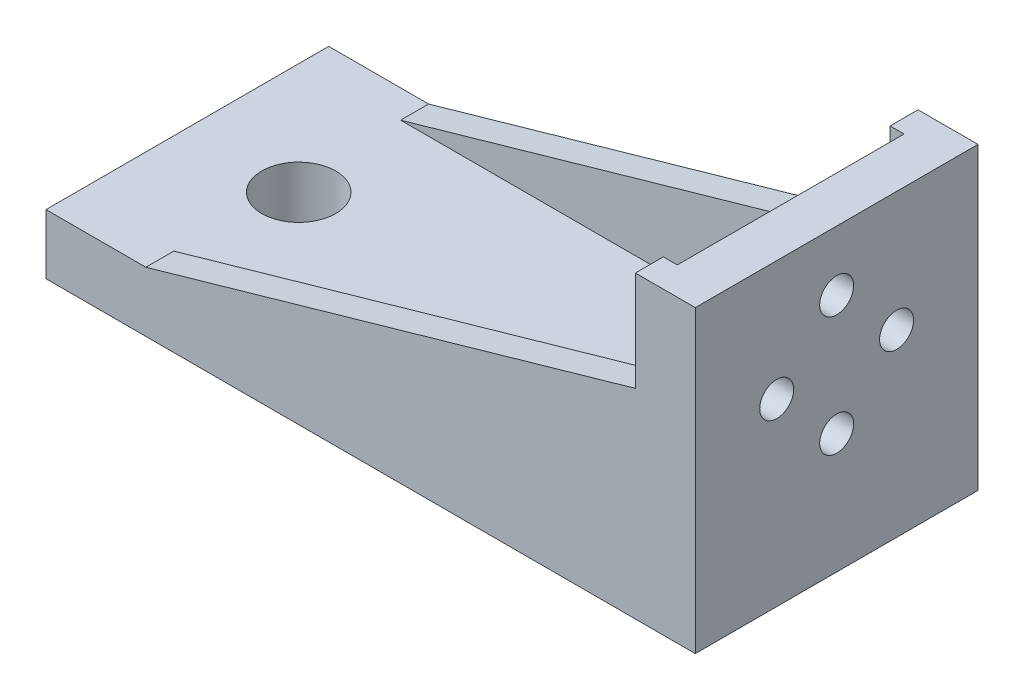
ISO-10303-21;
HEADER;
FILE_DESCRIPTION(('STEP AP214'),'2;1');
FILE_NAME('part.step','',(''),(''),'','','');
FILE_SCHEMA(('AUTOMOTIVE_DESIGN { 1 0 10303 214 1 1 1 1 }'));
ENDSEC;
DATA;
#1=APPLICATION_CONTEXT('core data for automotive mechanical design processes');
#2=APPLICATION_PROTOCOL_DEFINITION('international standard','automotive_design',2000,#1);
#3=PRODUCT_CONTEXT('',#1,'mechanical');
#4=PRODUCT('Part','Part','',(#3));
#5=PRODUCT_RELATED_PRODUCT_CATEGORY('part','',(#4));
#6=PRODUCT_DEFINITION_FORMATION('','',#4);
#7=PRODUCT_DEFINITION_CONTEXT('part definition',#1,'design');
#8=PRODUCT_DEFINITION('design','',#6,#7);
#9=PRODUCT_DEFINITION_SHAPE('','',#8);
#10=(LENGTH_UNIT() NAMED_UNIT(*) SI_UNIT(.MILLI.,.METRE.));
#11=(NAMED_UNIT(*) PLANE_ANGLE_UNIT() SI_UNIT($,.RADIAN.));
#12=(NAMED_UNIT(*) SI_UNIT($,.STERADIAN.) SOLID_ANGLE_UNIT());
#13=UNCERTAINTY_MEASURE_WITH_UNIT(LENGTH_MEASURE(1.E-05),#10,'distance_accuracy_value','');
#14=(GEOMETRIC_REPRESENTATION_CONTEXT(3) GLOBAL_UNCERTAINTY_ASSIGNED_CONTEXT((#13)) GLOBAL_UNIT_ASSIGNED_CONTEXT((#10,
#11,#12)) REPRESENTATION_CONTEXT('',''));
#15=CARTESIAN_POINT('',(0.,0.,0.));
#16=DIRECTION('',(0.,0.,1.));
#17=DIRECTION('',(1.,0.,0.));
#18=AXIS2_PLACEMENT_3D('',#15,#16,#17);
#19=CARTESIAN_POINT('',(59.,30.,14.15));
#20=DIRECTION('',(1.,0.,0.));
#21=DIRECTION('',(0.,1.,0.));
#22=AXIS2_PLACEMENT_3D('',#19,#20,#21);
#23=PLANE('',#22);
#24=DIRECTION('',(0.,-1.,0.));
#25=VECTOR('',#24,1.);
#26=CARTESIAN_POINT('',(59.,30.,-11.35));
#27=LINE('',#26,#25);
#28=CARTESIAN_POINT('',(59.,30.,-11.35));
#29=VERTEX_POINT('',#28);
#30=CARTESIAN_POINT('',(59.,20.,-11.35));
#31=VERTEX_POINT('',#30);
#32=EDGE_CURVE('E50',#29,#31,#27,.T.);
#33=ORIENTED_EDGE('',*,*,#32,.F.);
#34=DIRECTION('',(0.,0.,-1.));
#35=VECTOR('',#34,1.);
#36=CARTESIAN_POINT('',(59.,30.,14.15));
#37=LINE('',#36,#35);
#38=CARTESIAN_POINT('',(59.,30.,-14.15));
#39=VERTEX_POINT('',#38);
#40=EDGE_CURVE('E129',#29,#39,#37,.T.);
#41=ORIENTED_EDGE('',*,*,#40,.T.);
#42=DIRECTION('',(0.,-1.,0.));
#43=VECTOR('',#42,1.);
#44=CARTESIAN_POINT('',(59.,30.,-14.15));
#45=LINE('',#44,#43);
#46=CARTESIAN_POINT('',(59.,20.,-14.15));
#47=VERTEX_POINT('',#46);
#48=EDGE_CURVE('E148',#39,#47,#45,.T.);
#49=ORIENTED_EDGE('',*,*,#48,.T.);
#50=DIRECTION('',(0.,0.,-1.));
#51=VECTOR('',#50,1.);
#52=CARTESIAN_POINT('',(59.,20.,14.15));
#53=LINE('',#52,#51);
#54=EDGE_CURVE('E130',#31,#47,#53,.T.);
#55=ORIENTED_EDGE('',*,*,#54,.F.);
#56=EDGE_LOOP('',(#33,#41,#49,#55));
#57=FACE_BOUND('',#56,.T.);
#58=ADVANCED_FACE('F35',(#57),#23,.F.);
#59=CARTESIAN_POINT('',(59.,20.,14.15));
#60=DIRECTION('',(0.274721127897378,-0.961523947640823,0.));
#61=DIRECTION('',(0.961523947640823,0.274721127897378,0.));
#62=AXIS2_PLACEMENT_3D('',#59,#60,#61);
#63=PLANE('',#62);
#64=DIRECTION('',(-0.961523947640823,-0.274721127897378,0.));
#65=VECTOR('',#64,1.);
#66=CARTESIAN_POINT('',(59.,20.,-11.35));
#67=LINE('',#66,#65);
#68=CARTESIAN_POINT('',(10.,6.,-11.35));
#69=VERTEX_POINT('',#68);
#70=EDGE_CURVE('E192',#31,#69,#67,.T.);
#71=ORIENTED_EDGE('',*,*,#70,.F.);
#72=ORIENTED_EDGE('',*,*,#54,.T.);
#73=DIRECTION('',(-0.961523947640823,-0.274721127897378,0.));
#74=VECTOR('',#73,1.);
#75=CARTESIAN_POINT('',(59.,20.,-14.15));
#76=LINE('',#75,#74);
#77=CARTESIAN_POINT('',(10.,6.,-14.15));
#78=VERTEX_POINT('',#77);
#79=EDGE_CURVE('E151',#47,#78,#76,.T.);
#80=ORIENTED_EDGE('',*,*,#79,.T.);
#81=DIRECTION('',(0.,0.,-1.));
#82=VECTOR('',#81,1.);
#83=CARTESIAN_POINT('',(10.,6.,14.15));
#84=LINE('',#83,#82);
#85=EDGE_CURVE('E158',#69,#78,#84,.T.);
#86=ORIENTED_EDGE('',*,*,#85,.F.);
#87=EDGE_LOOP('',(#71,#72,#80,#86));
#88=FACE_BOUND('',#87,.T.);
#89=ADVANCED_FACE('F304',(#88),#63,.F.);
#90=CARTESIAN_POINT('',(0.,6.,14.15));
#91=DIRECTION('',(1.,0.,0.));
#92=DIRECTION('',(0.,1.,0.));
#93=AXIS2_PLACEMENT_3D('',#90,#91,#92);
#94=PLANE('',#93);
#95=DIRECTION('',(0.,-1.,0.));
#96=VECTOR('',#95,1.);
#97=CARTESIAN_POINT('',(0.,6.,-14.15));
#98=LINE('',#97,#96);
#99=CARTESIAN_POINT('',(0.,6.,-14.15));
#100=VERTEX_POINT('',#99);
#101=CARTESIAN_POINT('',(0.,0.,-14.15));
#102=VERTEX_POINT('',#101);
#103=EDGE_CURVE('E139',#100,#102,#98,.T.);
#104=ORIENTED_EDGE('',*,*,#103,.T.);
#105=DIRECTION('',(0.,0.,-1.));
#106=VECTOR('',#105,1.);
#107=CARTESIAN_POINT('',(0.,0.,14.15));
#108=LINE('',#107,#106);
#109=CARTESIAN_POINT('',(0.,0.,14.15));
#110=VERTEX_POINT('',#109);
#111=EDGE_CURVE('E11',#110,#102,#108,.T.);
#112=ORIENTED_EDGE('',*,*,#111,.F.);
#113=DIRECTION('',(0.,-1.,0.));
#114=VECTOR('',#113,1.);
#115=CARTESIAN_POINT('',(0.,6.,14.15));
#116=LINE('',#115,#114);
#117=CARTESIAN_POINT('',(0.,6.,14.15));
#118=VERTEX_POINT('',#117);
#119=EDGE_CURVE('E156',#118,#110,#116,.T.);
#120=ORIENTED_EDGE('',*,*,#119,.F.);
#121=DIRECTION('',(0.,0.,-1.));
#122=VECTOR('',#121,1.);
#123=CARTESIAN_POINT('',(0.,6.,14.15));
#124=LINE('',#123,#122);
#125=EDGE_CURVE('E89',#118,#100,#124,.T.);
#126=ORIENTED_EDGE('',*,*,#125,.T.);
#127=EDGE_LOOP('',(#104,#112,#120,#126));
#128=FACE_BOUND('',#127,.T.);
#129=ADVANCED_FACE('F37',(#128),#94,.F.);
#130=CARTESIAN_POINT('',(0.,0.,14.15));
#131=DIRECTION('',(0.,1.,0.));
#132=DIRECTION('',(0.,0.,1.));
#133=AXIS2_PLACEMENT_3D('',#130,#131,#132);
#134=PLANE('',#133);
#135=CARTESIAN_POINT('',(50.85,0.,0.));
#136=DIRECTION('',(0.,1.,0.));
#137=DIRECTION('',(0.,0.,1.));
#138=AXIS2_PLACEMENT_3D('',#135,#136,#137);
#139=CIRCLE('',#138,2.55);
#140=CARTESIAN_POINT('',(50.85,0.,2.55));
#141=VERTEX_POINT('',#140);
#142=EDGE_CURVE('E210',#141,#141,#139,.T.);
#143=ORIENTED_EDGE('',*,*,#142,.T.);
#144=EDGE_LOOP('',(#143));
#145=FACE_BOUND('',#144,.T.);
#146=CARTESIAN_POINT('',(11.15,0.,0.));
#147=DIRECTION('',(0.,1.,0.));
#148=DIRECTION('',(0.,0.,1.));
#149=AXIS2_PLACEMENT_3D('',#146,#147,#148);
#150=CIRCLE('',#149,3.7);
#151=CARTESIAN_POINT('',(11.15,0.,3.7));
#152=VERTEX_POINT('',#151);
#153=EDGE_CURVE('E220',#152,#152,#150,.T.);
#154=ORIENTED_EDGE('',*,*,#153,.T.);
#155=EDGE_LOOP('',(#154));
#156=FACE_BOUND('',#155,.T.);
#157=DIRECTION('',(1.,0.,0.));
#158=VECTOR('',#157,1.);
#159=CARTESIAN_POINT('',(0.,0.,-14.15));
#160=LINE('',#159,#158);
#161=CARTESIAN_POINT('',(65.,0.,-14.15));
#162=VERTEX_POINT('',#161);
#163=EDGE_CURVE('E141',#102,#162,#160,.T.);
#164=ORIENTED_EDGE('',*,*,#163,.T.);
#165=DIRECTION('',(0.,0.,-1.));
#166=VECTOR('',#165,1.);
#167=CARTESIAN_POINT('',(65.,0.,14.15));
#168=LINE('',#167,#166);
#169=CARTESIAN_POINT('',(65.,0.,14.15));
#170=VERTEX_POINT('',#169);
#171=EDGE_CURVE('E43',#170,#162,#168,.T.);
#172=ORIENTED_EDGE('',*,*,#171,.F.);
#173=DIRECTION('',(1.,0.,0.));
#174=VECTOR('',#173,1.);
#175=CARTESIAN_POINT('',(0.,0.,14.15));
#176=LINE('',#175,#174);
#177=EDGE_CURVE('E97',#110,#170,#176,.T.);
#178=ORIENTED_EDGE('',*,*,#177,.F.);
#179=ORIENTED_EDGE('',*,*,#111,.T.);
#180=EDGE_LOOP('',(#164,#172,#178,#179));
#181=FACE_BOUND('',#180,.T.);
#182=ADVANCED_FACE('F295',(#145,#156,#181),#134,.F.);
#183=CARTESIAN_POINT('',(65.,0.,14.15));
#184=DIRECTION('',(-1.,0.,0.));
#185=DIRECTION('',(0.,0.,1.));
#186=AXIS2_PLACEMENT_3D('',#183,#184,#185);
#187=PLANE('',#186);
#188=CARTESIAN_POINT('',(65.,24.,0.));
#189=DIRECTION('',(-1.,0.,0.));
#190=DIRECTION('',(0.,0.,1.));
#191=AXIS2_PLACEMENT_3D('',#188,#189,#190);
#192=CIRCLE('',#191,1.7);
#193=CARTESIAN_POINT('',(65.,24.,1.7));
#194=VERTEX_POINT('',#193);
#195=EDGE_CURVE('E247',#194,#194,#192,.T.);
#196=ORIENTED_EDGE('',*,*,#195,.T.);
#197=EDGE_LOOP('',(#196));
#198=FACE_BOUND('',#197,.T.);
#199=CARTESIAN_POINT('',(65.,12.,0.));
#200=DIRECTION('',(-1.,0.,0.));
#201=DIRECTION('',(0.,0.,1.));
#202=AXIS2_PLACEMENT_3D('',#199,#200,#201);
#203=CIRCLE('',#202,1.7);
#204=CARTESIAN_POINT('',(65.,12.,1.7));
#205=VERTEX_POINT('',#204);
#206=EDGE_CURVE('E241',#205,#205,#203,.T.);
#207=ORIENTED_EDGE('',*,*,#206,.T.);
#208=EDGE_LOOP('',(#207));
#209=FACE_BOUND('',#208,.T.);
#210=CARTESIAN_POINT('',(65.,18.,6.));
#211=DIRECTION('',(-1.,0.,0.));
#212=DIRECTION('',(0.,0.,1.));
#213=AXIS2_PLACEMENT_3D('',#210,#211,#212);
#214=CIRCLE('',#213,1.7);
#215=CARTESIAN_POINT('',(65.,18.,7.7));
#216=VERTEX_POINT('',#215);
#217=EDGE_CURVE('E235',#216,#216,#214,.T.);
#218=ORIENTED_EDGE('',*,*,#217,.T.);
#219=EDGE_LOOP('',(#218));
#220=FACE_BOUND('',#219,.T.);
#221=CARTESIAN_POINT('',(65.,18.,-6.));
#222=DIRECTION('',(-1.,0.,0.));
#223=DIRECTION('',(0.,0.,1.));
#224=AXIS2_PLACEMENT_3D('',#221,#222,#223);
#225=CIRCLE('',#224,1.7);
#226=CARTESIAN_POINT('',(65.,18.,-4.3));
#227=VERTEX_POINT('',#226);
#228=EDGE_CURVE('E229',#227,#227,#225,.T.);
#229=ORIENTED_EDGE('',*,*,#228,.T.);
#230=EDGE_LOOP('',(#229));
#231=FACE_BOUND('',#230,.T.);
#232=DIRECTION('',(0.,1.,0.));
#233=VECTOR('',#232,1.);
#234=CARTESIAN_POINT('',(65.,0.,-14.15));
#235=LINE('',#234,#233);
#236=CARTESIAN_POINT('',(65.,30.,-14.15));
#237=VERTEX_POINT('',#236);
#238=EDGE_CURVE('E143',#162,#237,#235,.T.);
#239=ORIENTED_EDGE('',*,*,#238,.T.);
#240=DIRECTION('',(0.,0.,-1.));
#241=VECTOR('',#240,1.);
#242=CARTESIAN_POINT('',(65.,30.,14.15));
#243=LINE('',#242,#241);
#244=CARTESIAN_POINT('',(65.,30.,14.15));
#245=VERTEX_POINT('',#244);
#246=EDGE_CURVE('E162',#245,#237,#243,.T.);
#247=ORIENTED_EDGE('',*,*,#246,.F.);
#248=DIRECTION('',(0.,1.,0.));
#249=VECTOR('',#248,1.);
#250=CARTESIAN_POINT('',(65.,0.,14.15));
#251=LINE('',#250,#249);
#252=EDGE_CURVE('E170',#170,#245,#251,.T.);
#253=ORIENTED_EDGE('',*,*,#252,.F.);
#254=ORIENTED_EDGE('',*,*,#171,.T.);
#255=EDGE_LOOP('',(#239,#247,#253,#254));
#256=FACE_BOUND('',#255,.T.);
#257=ADVANCED_FACE('F168',(#198,#209,#220,#231,#256),#187,.F.);
#258=CARTESIAN_POINT('',(65.,30.,14.15));
#259=DIRECTION('',(0.,-1.,0.));
#260=DIRECTION('',(1.,0.,0.));
#261=AXIS2_PLACEMENT_3D('',#258,#259,#260);
#262=PLANE('',#261);
#263=DIRECTION('',(0.,0.,-1.));
#264=VECTOR('',#263,1.);
#265=CARTESIAN_POINT('',(60.4,30.,11.35));
#266=LINE('',#265,#264);
#267=CARTESIAN_POINT('',(60.4,30.,11.35));
#268=VERTEX_POINT('',#267);
#269=CARTESIAN_POINT('',(60.4,30.,-11.35));
#270=VERTEX_POINT('',#269);
#271=EDGE_CURVE('E197',#268,#270,#266,.T.);
#272=ORIENTED_EDGE('',*,*,#271,.F.);
#273=DIRECTION('',(-1.,0.,0.));
#274=VECTOR('',#273,1.);
#275=CARTESIAN_POINT('',(60.4,30.,11.35));
#276=LINE('',#275,#274);
#277=CARTESIAN_POINT('',(59.,30.,11.35));
#278=VERTEX_POINT('',#277);
#279=EDGE_CURVE('E200',#268,#278,#276,.T.);
#280=ORIENTED_EDGE('',*,*,#279,.T.);
#281=CARTESIAN_POINT('',(59.,30.,14.15));
#282=VERTEX_POINT('',#281);
#283=EDGE_CURVE('E160',#282,#278,#37,.T.);
#284=ORIENTED_EDGE('',*,*,#283,.F.);
#285=DIRECTION('',(-1.,0.,0.));
#286=VECTOR('',#285,1.);
#287=CARTESIAN_POINT('',(65.,30.,14.15));
#288=LINE('',#287,#286);
#289=EDGE_CURVE('E116',#245,#282,#288,.T.);
#290=ORIENTED_EDGE('',*,*,#289,.F.);
#291=ORIENTED_EDGE('',*,*,#246,.T.);
#292=DIRECTION('',(-1.,0.,0.));
#293=VECTOR('',#292,1.);
#294=CARTESIAN_POINT('',(65.,30.,-14.15));
#295=LINE('',#294,#293);
#296=EDGE_CURVE('E145',#237,#39,#295,.T.);
#297=ORIENTED_EDGE('',*,*,#296,.T.);
#298=ORIENTED_EDGE('',*,*,#40,.F.);
#299=DIRECTION('',(-1.,0.,0.));
#300=VECTOR('',#299,1.);
#301=CARTESIAN_POINT('',(60.4,30.,-11.35));
#302=LINE('',#301,#300);
#303=EDGE_CURVE('E201',#270,#29,#302,.T.);
#304=ORIENTED_EDGE('',*,*,#303,.F.);
#305=EDGE_LOOP('',(#272,#280,#284,#290,#291,#297,#298,#304));
#306=FACE_BOUND('',#305,.T.);
#307=ADVANCED_FACE('F180',(#306),#262,.F.);
#308=ORIENTED_EDGE('',*,*,#283,.T.);
#309=DIRECTION('',(0.,-1.,0.));
#310=VECTOR('',#309,1.);
#311=CARTESIAN_POINT('',(59.,30.,11.35));
#312=LINE('',#311,#310);
#313=CARTESIAN_POINT('',(59.,20.,11.35));
#314=VERTEX_POINT('',#313);
#315=EDGE_CURVE('E126',#278,#314,#312,.T.);
#316=ORIENTED_EDGE('',*,*,#315,.T.);
#317=CARTESIAN_POINT('',(59.,20.,14.15));
#318=VERTEX_POINT('',#317);
#319=EDGE_CURVE('E123',#318,#314,#53,.T.);
#320=ORIENTED_EDGE('',*,*,#319,.F.);
#321=DIRECTION('',(0.,-1.,0.));
#322=VECTOR('',#321,1.);
#323=CARTESIAN_POINT('',(59.,30.,14.15));
#324=LINE('',#323,#322);
#325=EDGE_CURVE('E109',#282,#318,#324,.T.);
#326=ORIENTED_EDGE('',*,*,#325,.F.);
#327=EDGE_LOOP('',(#308,#316,#320,#326));
#328=FACE_BOUND('',#327,.T.);
#329=ADVANCED_FACE('F124',(#328),#23,.F.);
#330=ORIENTED_EDGE('',*,*,#319,.T.);
#331=DIRECTION('',(-0.961523947640823,-0.274721127897378,0.));
#332=VECTOR('',#331,1.);
#333=CARTESIAN_POINT('',(59.,20.,11.35));
#334=LINE('',#333,#332);
#335=CARTESIAN_POINT('',(10.,6.,11.35));
#336=VERTEX_POINT('',#335);
#337=EDGE_CURVE('E189',#314,#336,#334,.T.);
#338=ORIENTED_EDGE('',*,*,#337,.T.);
#339=CARTESIAN_POINT('',(10.,6.,14.15));
#340=VERTEX_POINT('',#339);
#341=EDGE_CURVE('E134',#340,#336,#84,.T.);
#342=ORIENTED_EDGE('',*,*,#341,.F.);
#343=DIRECTION('',(-0.961523947640823,-0.274721127897378,0.));
#344=VECTOR('',#343,1.);
#345=CARTESIAN_POINT('',(59.,20.,14.15));
#346=LINE('',#345,#344);
#347=EDGE_CURVE('E113',#318,#340,#346,.T.);
#348=ORIENTED_EDGE('',*,*,#347,.F.);
#349=EDGE_LOOP('',(#330,#338,#342,#348));
#350=FACE_BOUND('',#349,.T.);
#351=ADVANCED_FACE('F132',(#350),#63,.F.);
#352=CARTESIAN_POINT('',(10.,6.,14.15));
#353=DIRECTION('',(0.,-1.,0.));
#354=DIRECTION('',(1.,0.,0.));
#355=AXIS2_PLACEMENT_3D('',#352,#353,#354);
#356=PLANE('',#355);
#357=CARTESIAN_POINT('',(50.85,6.,0.));
#358=DIRECTION('',(0.,-1.,0.));
#359=DIRECTION('',(1.,0.,0.));
#360=AXIS2_PLACEMENT_3D('',#357,#358,#359);
#361=CIRCLE('',#360,2.55);
#362=CARTESIAN_POINT('',(53.4,6.,0.));
#363=VERTEX_POINT('',#362);
#364=EDGE_CURVE('E224',#363,#363,#361,.T.);
#365=ORIENTED_EDGE('',*,*,#364,.T.);
#366=EDGE_LOOP('',(#365));
#367=FACE_BOUND('',#366,.T.);
#368=CARTESIAN_POINT('',(11.15,6.,0.));
#369=DIRECTION('',(0.,-1.,0.));
#370=DIRECTION('',(1.,0.,0.));
#371=AXIS2_PLACEMENT_3D('',#368,#369,#370);
#372=CIRCLE('',#371,3.7);
#373=CARTESIAN_POINT('',(14.85,6.,0.));
#374=VERTEX_POINT('',#373);
#375=EDGE_CURVE('E217',#374,#374,#372,.T.);
#376=ORIENTED_EDGE('',*,*,#375,.T.);
#377=EDGE_LOOP('',(#376));
#378=FACE_BOUND('',#377,.T.);
#379=ORIENTED_EDGE('',*,*,#341,.T.);
#380=DIRECTION('',(1.,0.,0.));
#381=VECTOR('',#380,1.);
#382=CARTESIAN_POINT('',(0.,6.,11.35));
#383=LINE('',#382,#381);
#384=CARTESIAN_POINT('',(60.4,6.,11.35));
#385=VERTEX_POINT('',#384);
#386=EDGE_CURVE('E203',#336,#385,#383,.T.);
#387=ORIENTED_EDGE('',*,*,#386,.T.);
#388=DIRECTION('',(0.,0.,-1.));
#389=VECTOR('',#388,1.);
#390=CARTESIAN_POINT('',(60.4,6.,11.35));
#391=LINE('',#390,#389);
#392=CARTESIAN_POINT('',(60.4,6.,-11.35));
#393=VERTEX_POINT('',#392);
#394=EDGE_CURVE('E194',#385,#393,#391,.T.);
#395=ORIENTED_EDGE('',*,*,#394,.T.);
#396=DIRECTION('',(1.,0.,0.));
#397=VECTOR('',#396,1.);
#398=CARTESIAN_POINT('',(0.,6.,-11.35));
#399=LINE('',#398,#397);
#400=EDGE_CURVE('E207',#69,#393,#399,.T.);
#401=ORIENTED_EDGE('',*,*,#400,.F.);
#402=ORIENTED_EDGE('',*,*,#85,.T.);
#403=DIRECTION('',(-1.,0.,0.));
#404=VECTOR('',#403,1.);
#405=CARTESIAN_POINT('',(10.,6.,-14.15));
#406=LINE('',#405,#404);
#407=EDGE_CURVE('E154',#78,#100,#406,.T.);
#408=ORIENTED_EDGE('',*,*,#407,.T.);
#409=ORIENTED_EDGE('',*,*,#125,.F.);
#410=DIRECTION('',(-1.,0.,0.));
#411=VECTOR('',#410,1.);
#412=CARTESIAN_POINT('',(10.,6.,14.15));
#413=LINE('',#412,#411);
#414=EDGE_CURVE('E59',#340,#118,#413,.T.);
#415=ORIENTED_EDGE('',*,*,#414,.F.);
#416=EDGE_LOOP('',(#379,#387,#395,#401,#402,#408,#409,#415));
#417=FACE_BOUND('',#416,.T.);
#418=ADVANCED_FACE('F292',(#367,#378,#417),#356,.F.);
#419=CARTESIAN_POINT('',(0.,0.,14.15));
#420=DIRECTION('',(0.,0.,1.));
#421=DIRECTION('',(1.,0.,0.));
#422=AXIS2_PLACEMENT_3D('',#419,#420,#421);
#423=PLANE('',#422);
#424=ORIENTED_EDGE('',*,*,#119,.T.);
#425=ORIENTED_EDGE('',*,*,#177,.T.);
#426=ORIENTED_EDGE('',*,*,#252,.T.);
#427=ORIENTED_EDGE('',*,*,#289,.T.);
#428=ORIENTED_EDGE('',*,*,#325,.T.);
#429=ORIENTED_EDGE('',*,*,#347,.T.);
#430=ORIENTED_EDGE('',*,*,#414,.T.);
#431=EDGE_LOOP('',(#424,#425,#426,#427,#428,#429,#430));
#432=FACE_BOUND('',#431,.T.);
#433=ADVANCED_FACE('F111',(#432),#423,.T.);
#434=CARTESIAN_POINT('',(0.,0.,-14.15));
#435=DIRECTION('',(0.,0.,1.));
#436=DIRECTION('',(1.,0.,0.));
#437=AXIS2_PLACEMENT_3D('',#434,#435,#436);
#438=PLANE('',#437);
#439=ORIENTED_EDGE('',*,*,#103,.F.);
#440=ORIENTED_EDGE('',*,*,#407,.F.);
#441=ORIENTED_EDGE('',*,*,#79,.F.);
#442=ORIENTED_EDGE('',*,*,#48,.F.);
#443=ORIENTED_EDGE('',*,*,#296,.F.);
#444=ORIENTED_EDGE('',*,*,#238,.F.);
#445=ORIENTED_EDGE('',*,*,#163,.F.);
#446=EDGE_LOOP('',(#439,#440,#441,#442,#443,#444,#445));
#447=FACE_BOUND('',#446,.T.);
#448=ADVANCED_FACE('F174',(#447),#438,.F.);
#449=CARTESIAN_POINT('',(0.,0.,11.35));
#450=DIRECTION('',(0.,0.,1.));
#451=DIRECTION('',(1.,0.,0.));
#452=AXIS2_PLACEMENT_3D('',#449,#450,#451);
#453=PLANE('',#452);
#454=ORIENTED_EDGE('',*,*,#279,.F.);
#455=DIRECTION('',(0.,1.,0.));
#456=VECTOR('',#455,1.);
#457=CARTESIAN_POINT('',(60.4,6.,11.35));
#458=LINE('',#457,#456);
#459=EDGE_CURVE('E212',#385,#268,#458,.T.);
#460=ORIENTED_EDGE('',*,*,#459,.F.);
#461=ORIENTED_EDGE('',*,*,#386,.F.);
#462=ORIENTED_EDGE('',*,*,#337,.F.);
#463=ORIENTED_EDGE('',*,*,#315,.F.);
#464=EDGE_LOOP('',(#454,#460,#461,#462,#463));
#465=FACE_BOUND('',#464,.T.);
#466=ADVANCED_FACE('F290',(#465),#453,.F.);
#467=CARTESIAN_POINT('',(0.,0.,-11.35));
#468=DIRECTION('',(0.,0.,1.));
#469=DIRECTION('',(1.,0.,0.));
#470=AXIS2_PLACEMENT_3D('',#467,#468,#469);
#471=PLANE('',#470);
#472=ORIENTED_EDGE('',*,*,#32,.T.);
#473=ORIENTED_EDGE('',*,*,#70,.T.);
#474=ORIENTED_EDGE('',*,*,#400,.T.);
#475=DIRECTION('',(0.,1.,0.));
#476=VECTOR('',#475,1.);
#477=CARTESIAN_POINT('',(60.4,6.,-11.35));
#478=LINE('',#477,#476);
#479=EDGE_CURVE('E204',#393,#270,#478,.T.);
#480=ORIENTED_EDGE('',*,*,#479,.T.);
#481=ORIENTED_EDGE('',*,*,#303,.T.);
#482=EDGE_LOOP('',(#472,#473,#474,#480,#481));
#483=FACE_BOUND('',#482,.T.);
#484=ADVANCED_FACE('F260',(#483),#471,.T.);
#485=CARTESIAN_POINT('',(60.4,6.,11.35));
#486=DIRECTION('',(-1.,0.,0.));
#487=DIRECTION('',(0.,0.,1.));
#488=AXIS2_PLACEMENT_3D('',#485,#486,#487);
#489=PLANE('',#488);
#490=CARTESIAN_POINT('',(60.4,24.,0.));
#491=DIRECTION('',(-1.,0.,0.));
#492=DIRECTION('',(0.,0.,1.));
#493=AXIS2_PLACEMENT_3D('',#490,#491,#492);
#494=CIRCLE('',#493,1.7);
#495=CARTESIAN_POINT('',(60.4,24.,1.7));
#496=VERTEX_POINT('',#495);
#497=EDGE_CURVE('E221',#496,#496,#494,.T.);
#498=ORIENTED_EDGE('',*,*,#497,.F.);
#499=EDGE_LOOP('',(#498));
#500=FACE_BOUND('',#499,.T.);
#501=CARTESIAN_POINT('',(60.4,12.,0.));
#502=DIRECTION('',(-1.,0.,0.));
#503=DIRECTION('',(0.,0.,1.));
#504=AXIS2_PLACEMENT_3D('',#501,#502,#503);
#505=CIRCLE('',#504,1.7);
#506=CARTESIAN_POINT('',(60.4,12.,1.7));
#507=VERTEX_POINT('',#506);
#508=EDGE_CURVE('E244',#507,#507,#505,.T.);
#509=ORIENTED_EDGE('',*,*,#508,.F.);
#510=EDGE_LOOP('',(#509));
#511=FACE_BOUND('',#510,.T.);
#512=CARTESIAN_POINT('',(60.4,18.,6.));
#513=DIRECTION('',(-1.,0.,0.));
#514=DIRECTION('',(0.,0.,1.));
#515=AXIS2_PLACEMENT_3D('',#512,#513,#514);
#516=CIRCLE('',#515,1.7);
#517=CARTESIAN_POINT('',(60.4,18.,7.7));
#518=VERTEX_POINT('',#517);
#519=EDGE_CURVE('E238',#518,#518,#516,.T.);
#520=ORIENTED_EDGE('',*,*,#519,.F.);
#521=EDGE_LOOP('',(#520));
#522=FACE_BOUND('',#521,.T.);
#523=CARTESIAN_POINT('',(60.4,18.,-6.));
#524=DIRECTION('',(-1.,0.,0.));
#525=DIRECTION('',(0.,0.,1.));
#526=AXIS2_PLACEMENT_3D('',#523,#524,#525);
#527=CIRCLE('',#526,1.7);
#528=CARTESIAN_POINT('',(60.4,18.,-4.3));
#529=VERTEX_POINT('',#528);
#530=EDGE_CURVE('E232',#529,#529,#527,.T.);
#531=ORIENTED_EDGE('',*,*,#530,.F.);
#532=EDGE_LOOP('',(#531));
#533=FACE_BOUND('',#532,.T.);
#534=ORIENTED_EDGE('',*,*,#479,.F.);
#535=ORIENTED_EDGE('',*,*,#394,.F.);
#536=ORIENTED_EDGE('',*,*,#459,.T.);
#537=ORIENTED_EDGE('',*,*,#271,.T.);
#538=EDGE_LOOP('',(#534,#535,#536,#537));
#539=FACE_BOUND('',#538,.T.);
#540=ADVANCED_FACE('F256',(#500,#511,#522,#533,#539),#489,.T.);
#541=CARTESIAN_POINT('',(11.15,30.001,0.));
#542=DIRECTION('',(0.,-1.,0.));
#543=DIRECTION('',(0.,0.,-1.));
#544=AXIS2_PLACEMENT_3D('',#541,#542,#543);
#545=CYLINDRICAL_SURFACE('',#544,3.7);
#546=ORIENTED_EDGE('',*,*,#153,.F.);
#547=EDGE_LOOP('',(#546));
#548=FACE_BOUND('',#547,.T.);
#549=ORIENTED_EDGE('',*,*,#375,.F.);
#550=EDGE_LOOP('',(#549));
#551=FACE_BOUND('',#550,.T.);
#552=ADVANCED_FACE('F259',(#548,#551),#545,.F.);
#553=CARTESIAN_POINT('',(50.85,30.001,0.));
#554=DIRECTION('',(0.,-1.,0.));
#555=DIRECTION('',(0.,0.,-1.));
#556=AXIS2_PLACEMENT_3D('',#553,#554,#555);
#557=CYLINDRICAL_SURFACE('',#556,2.55);
#558=ORIENTED_EDGE('',*,*,#142,.F.);
#559=EDGE_LOOP('',(#558));
#560=FACE_BOUND('',#559,.T.);
#561=ORIENTED_EDGE('',*,*,#364,.F.);
#562=EDGE_LOOP('',(#561));
#563=FACE_BOUND('',#562,.T.);
#564=ADVANCED_FACE('F334',(#560,#563),#557,.F.);
#565=CARTESIAN_POINT('',(65.001,18.,-6.));
#566=DIRECTION('',(-1.,0.,0.));
#567=DIRECTION('',(0.,0.,1.));
#568=AXIS2_PLACEMENT_3D('',#565,#566,#567);
#569=CYLINDRICAL_SURFACE('',#568,1.7);
#570=ORIENTED_EDGE('',*,*,#530,.T.);
#571=EDGE_LOOP('',(#570));
#572=FACE_BOUND('',#571,.T.);
#573=ORIENTED_EDGE('',*,*,#228,.F.);
#574=EDGE_LOOP('',(#573));
#575=FACE_BOUND('',#574,.T.);
#576=ADVANCED_FACE('F349',(#572,#575),#569,.F.);
#577=CARTESIAN_POINT('',(65.001,18.,6.));
#578=DIRECTION('',(-1.,0.,0.));
#579=DIRECTION('',(0.,0.,1.));
#580=AXIS2_PLACEMENT_3D('',#577,#578,#579);
#581=CYLINDRICAL_SURFACE('',#580,1.7);
#582=ORIENTED_EDGE('',*,*,#519,.T.);
#583=EDGE_LOOP('',(#582));
#584=FACE_BOUND('',#583,.T.);
#585=ORIENTED_EDGE('',*,*,#217,.F.);
#586=EDGE_LOOP('',(#585));
#587=FACE_BOUND('',#586,.T.);
#588=ADVANCED_FACE('F354',(#584,#587),#581,.F.);
#589=CARTESIAN_POINT('',(65.001,12.,0.));
#590=DIRECTION('',(-1.,0.,0.));
#591=DIRECTION('',(0.,0.,1.));
#592=AXIS2_PLACEMENT_3D('',#589,#590,#591);
#593=CYLINDRICAL_SURFACE('',#592,1.7);
#594=ORIENTED_EDGE('',*,*,#508,.T.);
#595=EDGE_LOOP('',(#594));
#596=FACE_BOUND('',#595,.T.);
#597=ORIENTED_EDGE('',*,*,#206,.F.);
#598=EDGE_LOOP('',(#597));
#599=FACE_BOUND('',#598,.T.);
#600=ADVANCED_FACE('F364',(#596,#599),#593,.F.);
#601=CARTESIAN_POINT('',(65.001,24.,0.));
#602=DIRECTION('',(-1.,0.,0.));
#603=DIRECTION('',(0.,0.,1.));
#604=AXIS2_PLACEMENT_3D('',#601,#602,#603);
#605=CYLINDRICAL_SURFACE('',#604,1.7);
#606=ORIENTED_EDGE('',*,*,#497,.T.);
#607=EDGE_LOOP('',(#606));
#608=FACE_BOUND('',#607,.T.);
#609=ORIENTED_EDGE('',*,*,#195,.F.);
#610=EDGE_LOOP('',(#609));
#611=FACE_BOUND('',#610,.T.);
#612=ADVANCED_FACE('F253',(#608,#611),#605,.F.);
#613=CLOSED_SHELL('',(#58,#89,#129,#182,#257,#307,#329,#351,#418,#433,#448,#466,#484,#540,#552,
#564,#576,#588,#600,#612));
#614=MANIFOLD_SOLID_BREP('B2',#613);
#615=ADVANCED_BREP_SHAPE_REPRESENTATION('',(#18,#614),#14);
#616=SHAPE_DEFINITION_REPRESENTATION(#9,#615);
ENDSEC;
END-ISO-10303-21;
